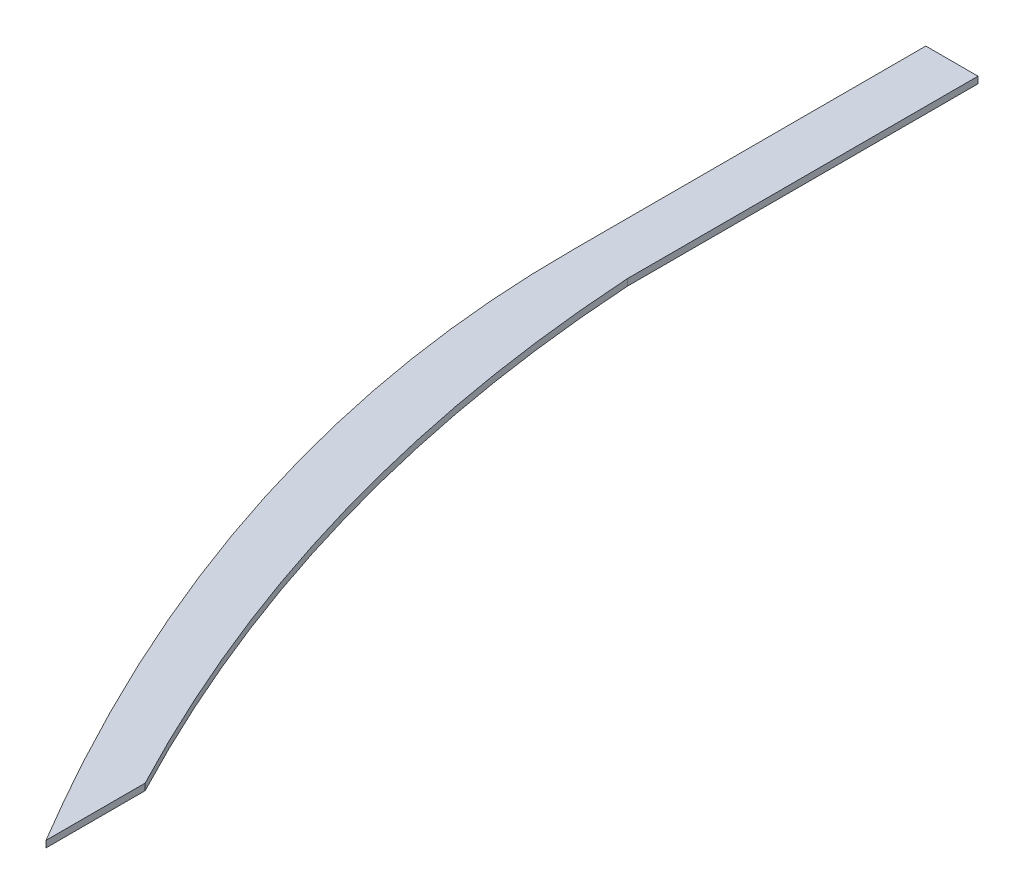
ISO-10303-21;
HEADER;
FILE_DESCRIPTION(('STEP AP214'),'2;1');
FILE_NAME('part.step','',(''),(''),'','','');
FILE_SCHEMA(('AUTOMOTIVE_DESIGN { 1 0 10303 214 1 1 1 1 }'));
ENDSEC;
DATA;
#1=APPLICATION_CONTEXT('core data for automotive mechanical design processes');
#2=APPLICATION_PROTOCOL_DEFINITION('international standard','automotive_design',2000,#1);
#3=PRODUCT_CONTEXT('',#1,'mechanical');
#4=PRODUCT('Part','Part','',(#3));
#5=PRODUCT_RELATED_PRODUCT_CATEGORY('part','',(#4));
#6=PRODUCT_DEFINITION_FORMATION('','',#4);
#7=PRODUCT_DEFINITION_CONTEXT('part definition',#1,'design');
#8=PRODUCT_DEFINITION('design','',#6,#7);
#9=PRODUCT_DEFINITION_SHAPE('','',#8);
#10=(LENGTH_UNIT() NAMED_UNIT(*) SI_UNIT(.MILLI.,.METRE.));
#11=(NAMED_UNIT(*) PLANE_ANGLE_UNIT() SI_UNIT($,.RADIAN.));
#12=(NAMED_UNIT(*) SI_UNIT($,.STERADIAN.) SOLID_ANGLE_UNIT());
#13=UNCERTAINTY_MEASURE_WITH_UNIT(LENGTH_MEASURE(1.E-05),#10,'distance_accuracy_value','');
#14=(GEOMETRIC_REPRESENTATION_CONTEXT(3) GLOBAL_UNCERTAINTY_ASSIGNED_CONTEXT((#13)) GLOBAL_UNIT_ASSIGNED_CONTEXT((#10,
#11,#12)) REPRESENTATION_CONTEXT('',''));
#15=CARTESIAN_POINT('',(0.,0.,0.));
#16=DIRECTION('',(0.,0.,1.));
#17=DIRECTION('',(1.,0.,0.));
#18=AXIS2_PLACEMENT_3D('',#15,#16,#17);
#19=CARTESIAN_POINT('',(-82.8820344103144,4.,-336.412581573586));
#20=DIRECTION('',(0.,0.,1.));
#21=DIRECTION('',(1.,0.,0.));
#22=AXIS2_PLACEMENT_3D('',#19,#20,#21);
#23=PLANE('',#22);
#24=DIRECTION('',(-1.,0.,0.));
#25=VECTOR('',#24,1.);
#26=CARTESIAN_POINT('',(-82.8820344103144,0.,-336.412581573586));
#27=LINE('',#26,#25);
#28=CARTESIAN_POINT('',(-51.3126025520314,0.,-336.412581573586));
#29=VERTEX_POINT('',#28);
#30=CARTESIAN_POINT('',(-82.8820344103144,0.,-336.412581573586));
#31=VERTEX_POINT('',#30);
#32=EDGE_CURVE('E161',#29,#31,#27,.T.);
#33=ORIENTED_EDGE('',*,*,#32,.T.);
#34=DIRECTION('',(0.,-1.,0.));
#35=VECTOR('',#34,1.);
#36=CARTESIAN_POINT('',(-82.8820344103144,4.,-336.412581573586));
#37=LINE('',#36,#35);
#38=CARTESIAN_POINT('',(-82.8820344103144,4.,-336.412581573586));
#39=VERTEX_POINT('',#38);
#40=EDGE_CURVE('E11',#39,#31,#37,.T.);
#41=ORIENTED_EDGE('',*,*,#40,.F.);
#42=DIRECTION('',(-1.,0.,0.));
#43=VECTOR('',#42,1.);
#44=CARTESIAN_POINT('',(-82.8820344103144,4.,-336.412581573586));
#45=LINE('',#44,#43);
#46=CARTESIAN_POINT('',(-51.3126025520314,4.,-336.412581573586));
#47=VERTEX_POINT('',#46);
#48=EDGE_CURVE('E142',#47,#39,#45,.T.);
#49=ORIENTED_EDGE('',*,*,#48,.F.);
#50=DIRECTION('',(0.,-1.,0.));
#51=VECTOR('',#50,1.);
#52=CARTESIAN_POINT('',(-51.3126025520314,4.,-336.412581573586));
#53=LINE('',#52,#51);
#54=EDGE_CURVE('E112',#47,#29,#53,.T.);
#55=ORIENTED_EDGE('',*,*,#54,.T.);
#56=EDGE_LOOP('',(#33,#41,#49,#55));
#57=FACE_BOUND('',#56,.T.);
#58=ADVANCED_FACE('F32',(#57),#23,.F.);
#59=CARTESIAN_POINT('',(-82.8820344103144,4.,-336.412581573586));
#60=DIRECTION('',(1.,0.,0.));
#61=DIRECTION('',(0.,0.,-1.));
#62=AXIS2_PLACEMENT_3D('',#59,#60,#61);
#63=PLANE('',#62);
#64=DIRECTION('',(0.,0.,1.));
#65=VECTOR('',#64,1.);
#66=CARTESIAN_POINT('',(-82.8820344103144,0.,-336.412581573586));
#67=LINE('',#66,#65);
#68=CARTESIAN_POINT('',(-82.8820344103144,0.,-124.412581573586));
#69=VERTEX_POINT('',#68);
#70=EDGE_CURVE('E159',#31,#69,#67,.T.);
#71=ORIENTED_EDGE('',*,*,#70,.T.);
#72=DIRECTION('',(0.,-1.,0.));
#73=VECTOR('',#72,1.);
#74=CARTESIAN_POINT('',(-82.8820344103144,4.,-124.412581573586));
#75=LINE('',#74,#73);
#76=CARTESIAN_POINT('',(-82.8820344103144,4.,-124.412581573586));
#77=VERTEX_POINT('',#76);
#78=EDGE_CURVE('E40',#77,#69,#75,.T.);
#79=ORIENTED_EDGE('',*,*,#78,.F.);
#80=DIRECTION('',(0.,0.,1.));
#81=VECTOR('',#80,1.);
#82=CARTESIAN_POINT('',(-82.8820344103144,4.,-336.412581573586));
#83=LINE('',#82,#81);
#84=EDGE_CURVE('E85',#39,#77,#83,.T.);
#85=ORIENTED_EDGE('',*,*,#84,.F.);
#86=ORIENTED_EDGE('',*,*,#40,.T.);
#87=EDGE_LOOP('',(#71,#79,#85,#86));
#88=FACE_BOUND('',#87,.T.);
#89=ADVANCED_FACE('F132',(#88),#63,.F.);
#90=CARTESIAN_POINT('',(-82.8820344103144,4.,-124.412581573586));
#91=CARTESIAN_POINT('',(-84.1576809170689,4.,91.9903419691799));
#92=CARTESIAN_POINT('',(67.1179655896859,4.,345.800506642261));
#93=B_SPLINE_CURVE_WITH_KNOTS('',2,(#90,#91,#92),.UNSPECIFIED.,.F.,.F.,(3,3),(0.,1.),.UNSPECIFIED.);
#94=DIRECTION('',(0.,-1.,0.));
#95=VECTOR('',#94,1.);
#96=SURFACE_OF_LINEAR_EXTRUSION('',#93,#95);
#97=CARTESIAN_POINT('',(-82.8820344103144,0.,-124.412581573586));
#98=CARTESIAN_POINT('',(-84.1576809170689,0.,91.9903419691799));
#99=CARTESIAN_POINT('',(67.1179655896859,0.,345.800506642261));
#100=B_SPLINE_CURVE_WITH_KNOTS('',2,(#97,#98,#99),.UNSPECIFIED.,.F.,.F.,(3,3),(0.,1.),.UNSPECIFIED.);
#101=CARTESIAN_POINT('',(67.1179655896859,0.,345.800506642261));
#102=VERTEX_POINT('',#101);
#103=EDGE_CURVE('E155',#69,#102,#100,.T.);
#104=ORIENTED_EDGE('',*,*,#103,.T.);
#105=DIRECTION('',(0.,-1.,0.));
#106=VECTOR('',#105,1.);
#107=CARTESIAN_POINT('',(67.1179655896859,4.,345.800506642261));
#108=LINE('',#107,#106);
#109=CARTESIAN_POINT('',(67.1179655896859,4.,345.800506642261));
#110=VERTEX_POINT('',#109);
#111=EDGE_CURVE('E107',#110,#102,#108,.T.);
#112=ORIENTED_EDGE('',*,*,#111,.F.);
#113=EDGE_CURVE('E98',#77,#110,#93,.T.);
#114=ORIENTED_EDGE('',*,*,#113,.F.);
#115=ORIENTED_EDGE('',*,*,#78,.T.);
#116=EDGE_LOOP('',(#104,#112,#114,#115));
#117=FACE_BOUND('',#116,.T.);
#118=ADVANCED_FACE('F130',(#117),#96,.F.);
#119=CARTESIAN_POINT('',(67.1179655896857,4.,345.80050664226));
#120=DIRECTION('',(-1.,0.,0.));
#121=DIRECTION('',(0.,0.,1.));
#122=AXIS2_PLACEMENT_3D('',#119,#120,#121);
#123=PLANE('',#122);
#124=DIRECTION('',(0.,0.,-1.));
#125=VECTOR('',#124,1.);
#126=CARTESIAN_POINT('',(67.1179655896857,0.,345.80050664226));
#127=LINE('',#126,#125);
#128=CARTESIAN_POINT('',(67.1179655896857,0.,285.827231403112));
#129=VERTEX_POINT('',#128);
#130=EDGE_CURVE('E106',#102,#129,#127,.T.);
#131=ORIENTED_EDGE('',*,*,#130,.T.);
#132=DIRECTION('',(0.,-1.,0.));
#133=VECTOR('',#132,1.);
#134=CARTESIAN_POINT('',(67.1179655896857,4.,285.827231403112));
#135=LINE('',#134,#133);
#136=CARTESIAN_POINT('',(67.1179655896857,4.,285.827231403112));
#137=VERTEX_POINT('',#136);
#138=EDGE_CURVE('E103',#137,#129,#135,.T.);
#139=ORIENTED_EDGE('',*,*,#138,.F.);
#140=DIRECTION('',(0.,0.,-1.));
#141=VECTOR('',#140,1.);
#142=CARTESIAN_POINT('',(67.1179655896857,4.,345.80050664226));
#143=LINE('',#142,#141);
#144=EDGE_CURVE('E92',#110,#137,#143,.T.);
#145=ORIENTED_EDGE('',*,*,#144,.F.);
#146=ORIENTED_EDGE('',*,*,#111,.T.);
#147=EDGE_LOOP('',(#131,#139,#145,#146));
#148=FACE_BOUND('',#147,.T.);
#149=ADVANCED_FACE('F104',(#148),#123,.F.);
#150=CARTESIAN_POINT('',(67.1179655896857,4.,285.827231403113));
#151=CARTESIAN_POINT('',(-38.284160414101,4.,84.7184249056666));
#152=CARTESIAN_POINT('',(-51.3126025520314,4.,-124.412581573586));
#153=B_SPLINE_CURVE_WITH_KNOTS('',2,(#150,#151,#152),.UNSPECIFIED.,.F.,.F.,(3,3),(0.,1.),.UNSPECIFIED.);
#154=DIRECTION('',(0.,-1.,0.));
#155=VECTOR('',#154,1.);
#156=SURFACE_OF_LINEAR_EXTRUSION('',#153,#155);
#157=CARTESIAN_POINT('',(67.1179655896857,0.,285.827231403113));
#158=CARTESIAN_POINT('',(-38.284160414101,0.,84.7184249056666));
#159=CARTESIAN_POINT('',(-51.3126025520314,0.,-124.412581573586));
#160=B_SPLINE_CURVE_WITH_KNOTS('',2,(#157,#158,#159),.UNSPECIFIED.,.F.,.F.,(3,3),(0.,1.),.UNSPECIFIED.);
#161=CARTESIAN_POINT('',(-51.3126025520314,0.,-124.412581573586));
#162=VERTEX_POINT('',#161);
#163=EDGE_CURVE('E71',#129,#162,#160,.T.);
#164=ORIENTED_EDGE('',*,*,#163,.T.);
#165=DIRECTION('',(0.,-1.,0.));
#166=VECTOR('',#165,1.);
#167=CARTESIAN_POINT('',(-51.3126025520314,4.,-124.412581573586));
#168=LINE('',#167,#166);
#169=CARTESIAN_POINT('',(-51.3126025520314,4.,-124.412581573586));
#170=VERTEX_POINT('',#169);
#171=EDGE_CURVE('E108',#170,#162,#168,.T.);
#172=ORIENTED_EDGE('',*,*,#171,.F.);
#173=EDGE_CURVE('E96',#137,#170,#153,.T.);
#174=ORIENTED_EDGE('',*,*,#173,.F.);
#175=ORIENTED_EDGE('',*,*,#138,.T.);
#176=EDGE_LOOP('',(#164,#172,#174,#175));
#177=FACE_BOUND('',#176,.T.);
#178=ADVANCED_FACE('F110',(#177),#156,.F.);
#179=CARTESIAN_POINT('',(-51.3126025520314,4.,-336.412581573586));
#180=DIRECTION('',(-1.,0.,0.));
#181=DIRECTION('',(0.,0.,1.));
#182=AXIS2_PLACEMENT_3D('',#179,#180,#181);
#183=PLANE('',#182);
#184=DIRECTION('',(0.,0.,-1.));
#185=VECTOR('',#184,1.);
#186=CARTESIAN_POINT('',(-51.3126025520314,0.,-336.412581573586));
#187=LINE('',#186,#185);
#188=EDGE_CURVE('E77',#162,#29,#187,.T.);
#189=ORIENTED_EDGE('',*,*,#188,.T.);
#190=ORIENTED_EDGE('',*,*,#54,.F.);
#191=DIRECTION('',(0.,0.,-1.));
#192=VECTOR('',#191,1.);
#193=CARTESIAN_POINT('',(-51.3126025520314,4.,-336.412581573586));
#194=LINE('',#193,#192);
#195=EDGE_CURVE('E48',#170,#47,#194,.T.);
#196=ORIENTED_EDGE('',*,*,#195,.F.);
#197=ORIENTED_EDGE('',*,*,#171,.T.);
#198=EDGE_LOOP('',(#189,#190,#196,#197));
#199=FACE_BOUND('',#198,.T.);
#200=ADVANCED_FACE('F126',(#199),#183,.F.);
#201=CARTESIAN_POINT('',(-15.1907394476369,4.,82.7128749102149));
#202=DIRECTION('',(0.,-1.,0.));
#203=DIRECTION('',(0.,0.,-1.));
#204=AXIS2_PLACEMENT_3D('',#201,#202,#203);
#205=PLANE('',#204);
#206=ORIENTED_EDGE('',*,*,#48,.T.);
#207=ORIENTED_EDGE('',*,*,#84,.T.);
#208=ORIENTED_EDGE('',*,*,#113,.T.);
#209=ORIENTED_EDGE('',*,*,#144,.T.);
#210=ORIENTED_EDGE('',*,*,#173,.T.);
#211=ORIENTED_EDGE('',*,*,#195,.T.);
#212=EDGE_LOOP('',(#206,#207,#208,#209,#210,#211));
#213=FACE_BOUND('',#212,.T.);
#214=ADVANCED_FACE('F94',(#213),#205,.F.);
#215=CARTESIAN_POINT('',(-15.1907394476369,0.,82.7128749102149));
#216=DIRECTION('',(0.,-1.,0.));
#217=DIRECTION('',(0.,0.,-1.));
#218=AXIS2_PLACEMENT_3D('',#215,#216,#217);
#219=PLANE('',#218);
#220=ORIENTED_EDGE('',*,*,#32,.F.);
#221=ORIENTED_EDGE('',*,*,#188,.F.);
#222=ORIENTED_EDGE('',*,*,#163,.F.);
#223=ORIENTED_EDGE('',*,*,#130,.F.);
#224=ORIENTED_EDGE('',*,*,#103,.F.);
#225=ORIENTED_EDGE('',*,*,#70,.F.);
#226=EDGE_LOOP('',(#220,#221,#222,#223,#224,#225));
#227=FACE_BOUND('',#226,.T.);
#228=ADVANCED_FACE('F158',(#227),#219,.T.);
#229=CLOSED_SHELL('',(#58,#89,#118,#149,#178,#200,#214,#228));
#230=MANIFOLD_SOLID_BREP('B2',#229);
#231=ADVANCED_BREP_SHAPE_REPRESENTATION('',(#18,#230),#14);
#232=SHAPE_DEFINITION_REPRESENTATION(#9,#231);
ENDSEC;
END-ISO-10303-21;
